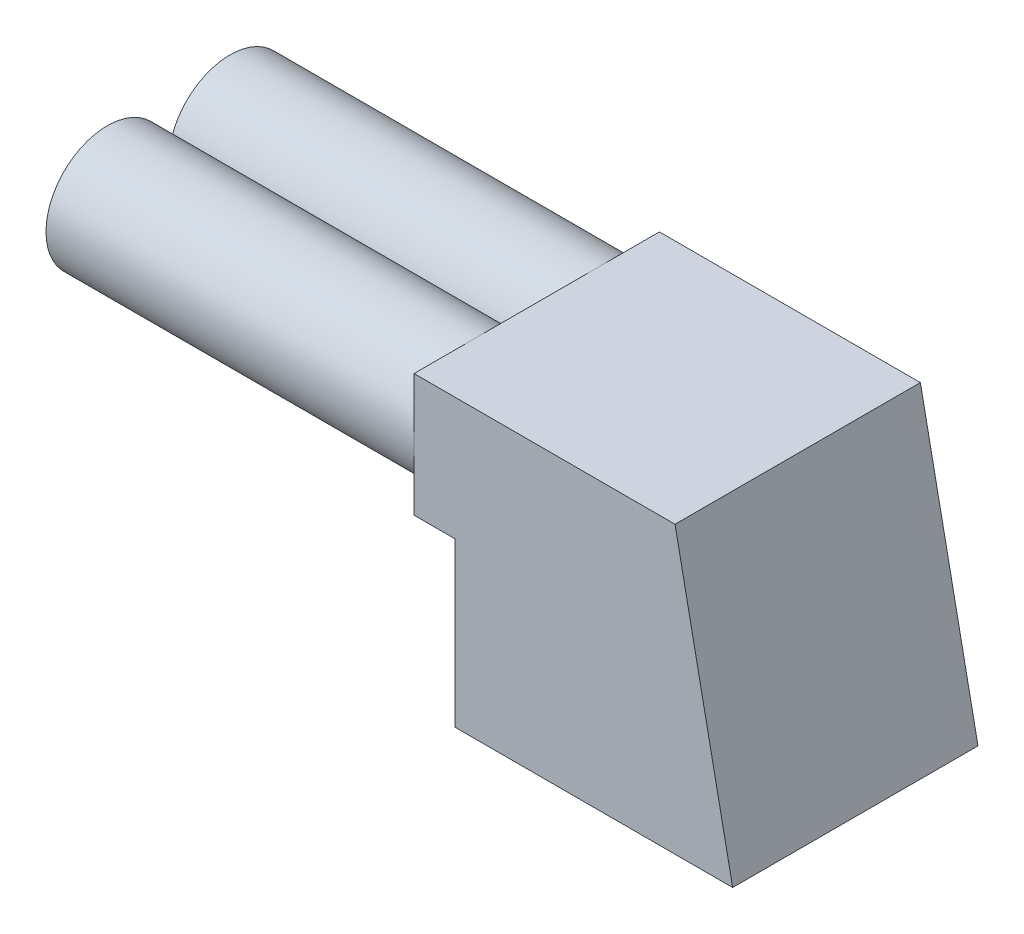
ISO-10303-21;
HEADER;
FILE_DESCRIPTION(('STEP AP214'),'2;1');
FILE_NAME('part.step','',(''),(''),'','','');
FILE_SCHEMA(('AUTOMOTIVE_DESIGN { 1 0 10303 214 1 1 1 1 }'));
ENDSEC;
DATA;
#1=APPLICATION_CONTEXT('core data for automotive mechanical design processes');
#2=APPLICATION_PROTOCOL_DEFINITION('international standard','automotive_design',2000,#1);
#3=PRODUCT_CONTEXT('',#1,'mechanical');
#4=PRODUCT('Part','Part','',(#3));
#5=PRODUCT_RELATED_PRODUCT_CATEGORY('part','',(#4));
#6=PRODUCT_DEFINITION_FORMATION('','',#4);
#7=PRODUCT_DEFINITION_CONTEXT('part definition',#1,'design');
#8=PRODUCT_DEFINITION('design','',#6,#7);
#9=PRODUCT_DEFINITION_SHAPE('','',#8);
#10=(LENGTH_UNIT() NAMED_UNIT(*) SI_UNIT(.MILLI.,.METRE.));
#11=(NAMED_UNIT(*) PLANE_ANGLE_UNIT() SI_UNIT($,.RADIAN.));
#12=(NAMED_UNIT(*) SI_UNIT($,.STERADIAN.) SOLID_ANGLE_UNIT());
#13=UNCERTAINTY_MEASURE_WITH_UNIT(LENGTH_MEASURE(1.E-05),#10,'distance_accuracy_value','');
#14=(GEOMETRIC_REPRESENTATION_CONTEXT(3) GLOBAL_UNCERTAINTY_ASSIGNED_CONTEXT((#13)) GLOBAL_UNIT_ASSIGNED_CONTEXT((#10,
#11,#12)) REPRESENTATION_CONTEXT('',''));
#15=CARTESIAN_POINT('',(0.,0.,0.));
#16=DIRECTION('',(0.,0.,1.));
#17=DIRECTION('',(1.,0.,0.));
#18=AXIS2_PLACEMENT_3D('',#15,#16,#17);
#19=CARTESIAN_POINT('',(-27.0557558945909,69.8940360610263,-30.));
#20=DIRECTION('',(-1.,0.,0.));
#21=DIRECTION('',(0.,0.,1.));
#22=AXIS2_PLACEMENT_3D('',#19,#20,#21);
#23=PLANE('',#22);
#24=DIRECTION('',(0.,-1.,0.));
#25=VECTOR('',#24,1.);
#26=CARTESIAN_POINT('',(-27.0557558945909,69.8940360610263,30.));
#27=LINE('',#26,#25);
#28=CARTESIAN_POINT('',(-27.0557558945909,39.8940360610263,30.));
#29=VERTEX_POINT('',#28);
#30=CARTESIAN_POINT('',(-27.0557558945909,0.,30.));
#31=VERTEX_POINT('',#30);
#32=EDGE_CURVE('E195',#29,#31,#27,.T.);
#33=ORIENTED_EDGE('',*,*,#32,.F.);
#34=DIRECTION('',(0.,0.,1.));
#35=VECTOR('',#34,1.);
#36=CARTESIAN_POINT('',(-27.0557558945909,39.8940360610263,-30.));
#37=LINE('',#36,#35);
#38=CARTESIAN_POINT('',(-27.0557558945909,39.8940360610263,-30.));
#39=VERTEX_POINT('',#38);
#40=EDGE_CURVE('E51',#39,#29,#37,.T.);
#41=ORIENTED_EDGE('',*,*,#40,.F.);
#42=DIRECTION('',(0.,-1.,0.));
#43=VECTOR('',#42,1.);
#44=CARTESIAN_POINT('',(-27.0557558945909,69.8940360610263,-30.));
#45=LINE('',#44,#43);
#46=CARTESIAN_POINT('',(-27.0557558945909,0.,-30.));
#47=VERTEX_POINT('',#46);
#48=EDGE_CURVE('E156',#39,#47,#45,.T.);
#49=ORIENTED_EDGE('',*,*,#48,.T.);
#50=DIRECTION('',(0.,0.,1.));
#51=VECTOR('',#50,1.);
#52=CARTESIAN_POINT('',(-27.0557558945909,0.,-30.));
#53=LINE('',#52,#51);
#54=EDGE_CURVE('E214',#47,#31,#53,.T.);
#55=ORIENTED_EDGE('',*,*,#54,.T.);
#56=EDGE_LOOP('',(#33,#41,#49,#55));
#57=FACE_BOUND('',#56,.T.);
#58=ADVANCED_FACE('F37',(#57),#23,.T.);
#59=CARTESIAN_POINT('',(26.7739251040222,69.8940360610263,-30.));
#60=DIRECTION('',(0.,1.,0.));
#61=DIRECTION('',(0.,0.,1.));
#62=AXIS2_PLACEMENT_3D('',#59,#60,#61);
#63=PLANE('',#62);
#64=DIRECTION('',(-1.,0.,0.));
#65=VECTOR('',#64,1.);
#66=CARTESIAN_POINT('',(26.7739251040222,69.8940360610263,-30.));
#67=LINE('',#66,#65);
#68=CARTESIAN_POINT('',(26.7739251040222,69.8940360610263,-30.));
#69=VERTEX_POINT('',#68);
#70=CARTESIAN_POINT('',(-37.0557558945909,69.8940360610263,-30.));
#71=VERTEX_POINT('',#70);
#72=EDGE_CURVE('E212',#69,#71,#67,.T.);
#73=ORIENTED_EDGE('',*,*,#72,.T.);
#74=DIRECTION('',(0.,0.,-1.));
#75=VECTOR('',#74,1.);
#76=CARTESIAN_POINT('',(-37.0557558945909,69.8940360610263,-30.));
#77=LINE('',#76,#75);
#78=CARTESIAN_POINT('',(-37.0557558945909,69.8940360610263,-15.));
#79=VERTEX_POINT('',#78);
#80=EDGE_CURVE('E248',#79,#71,#77,.T.);
#81=ORIENTED_EDGE('',*,*,#80,.F.);
#82=CARTESIAN_POINT('',(-37.0557558945909,69.8940360610263,15.));
#83=VERTEX_POINT('',#82);
#84=EDGE_CURVE('E250',#83,#79,#77,.T.);
#85=ORIENTED_EDGE('',*,*,#84,.F.);
#86=CARTESIAN_POINT('',(-37.0557558945909,69.8940360610263,30.));
#87=VERTEX_POINT('',#86);
#88=EDGE_CURVE('E164',#87,#83,#77,.T.);
#89=ORIENTED_EDGE('',*,*,#88,.F.);
#90=DIRECTION('',(-1.,0.,0.));
#91=VECTOR('',#90,1.);
#92=CARTESIAN_POINT('',(26.7739251040222,69.8940360610263,30.));
#93=LINE('',#92,#91);
#94=CARTESIAN_POINT('',(26.7739251040222,69.8940360610263,30.));
#95=VERTEX_POINT('',#94);
#96=EDGE_CURVE('E203',#95,#87,#93,.T.);
#97=ORIENTED_EDGE('',*,*,#96,.F.);
#98=DIRECTION('',(0.,0.,1.));
#99=VECTOR('',#98,1.);
#100=CARTESIAN_POINT('',(26.7739251040222,69.8940360610263,-30.));
#101=LINE('',#100,#99);
#102=EDGE_CURVE('E44',#69,#95,#101,.T.);
#103=ORIENTED_EDGE('',*,*,#102,.F.);
#104=EDGE_LOOP('',(#73,#81,#85,#89,#97,#103));
#105=FACE_BOUND('',#104,.T.);
#106=ADVANCED_FACE('F233',(#105),#63,.T.);
#107=CARTESIAN_POINT('',(40.8654646324549,0.,-30.));
#108=DIRECTION('',(0.980275441523285,0.197636177726469,0.));
#109=DIRECTION('',(-0.197636177726469,0.980275441523285,0.));
#110=AXIS2_PLACEMENT_3D('',#107,#108,#109);
#111=PLANE('',#110);
#112=ORIENTED_EDGE('',*,*,#102,.T.);
#113=DIRECTION('',(-0.197636177726469,0.980275441523285,0.));
#114=VECTOR('',#113,1.);
#115=CARTESIAN_POINT('',(40.8654646324549,0.,30.));
#116=LINE('',#115,#114);
#117=CARTESIAN_POINT('',(40.8654646324549,0.,30.));
#118=VERTEX_POINT('',#117);
#119=EDGE_CURVE('E200',#118,#95,#116,.T.);
#120=ORIENTED_EDGE('',*,*,#119,.F.);
#121=DIRECTION('',(0.,0.,1.));
#122=VECTOR('',#121,1.);
#123=CARTESIAN_POINT('',(40.8654646324549,0.,-30.));
#124=LINE('',#123,#122);
#125=CARTESIAN_POINT('',(40.8654646324549,0.,-30.));
#126=VERTEX_POINT('',#125);
#127=EDGE_CURVE('E216',#126,#118,#124,.T.);
#128=ORIENTED_EDGE('',*,*,#127,.F.);
#129=DIRECTION('',(-0.197636177726469,0.980275441523285,0.));
#130=VECTOR('',#129,1.);
#131=CARTESIAN_POINT('',(40.8654646324549,0.,-30.));
#132=LINE('',#131,#130);
#133=EDGE_CURVE('E209',#126,#69,#132,.T.);
#134=ORIENTED_EDGE('',*,*,#133,.T.);
#135=EDGE_LOOP('',(#112,#120,#128,#134));
#136=FACE_BOUND('',#135,.T.);
#137=ADVANCED_FACE('F229',(#136),#111,.T.);
#138=CARTESIAN_POINT('',(-27.0557558945909,0.,-30.));
#139=DIRECTION('',(0.,-1.,0.));
#140=DIRECTION('',(0.,0.,-1.));
#141=AXIS2_PLACEMENT_3D('',#138,#139,#140);
#142=PLANE('',#141);
#143=ORIENTED_EDGE('',*,*,#127,.T.);
#144=DIRECTION('',(1.,0.,0.));
#145=VECTOR('',#144,1.);
#146=CARTESIAN_POINT('',(-27.0557558945909,0.,30.));
#147=LINE('',#146,#145);
#148=EDGE_CURVE('E197',#31,#118,#147,.T.);
#149=ORIENTED_EDGE('',*,*,#148,.F.);
#150=ORIENTED_EDGE('',*,*,#54,.F.);
#151=DIRECTION('',(1.,0.,0.));
#152=VECTOR('',#151,1.);
#153=CARTESIAN_POINT('',(-27.0557558945909,0.,-30.));
#154=LINE('',#153,#152);
#155=EDGE_CURVE('E206',#47,#126,#154,.T.);
#156=ORIENTED_EDGE('',*,*,#155,.T.);
#157=EDGE_LOOP('',(#143,#149,#150,#156));
#158=FACE_BOUND('',#157,.T.);
#159=ADVANCED_FACE('F223',(#158),#142,.T.);
#160=CARTESIAN_POINT('',(0.,0.,-30.));
#161=DIRECTION('',(0.,0.,1.));
#162=DIRECTION('',(1.,0.,0.));
#163=AXIS2_PLACEMENT_3D('',#160,#161,#162);
#164=PLANE('',#163);
#165=DIRECTION('',(0.,-1.,0.));
#166=VECTOR('',#165,1.);
#167=CARTESIAN_POINT('',(-37.0557558945909,69.8940360610263,-30.));
#168=LINE('',#167,#166);
#169=CARTESIAN_POINT('',(-37.0557558945909,54.8940360610263,-30.));
#170=VERTEX_POINT('',#169);
#171=EDGE_CURVE('E142',#71,#170,#168,.T.);
#172=ORIENTED_EDGE('',*,*,#171,.F.);
#173=ORIENTED_EDGE('',*,*,#72,.F.);
#174=ORIENTED_EDGE('',*,*,#133,.F.);
#175=ORIENTED_EDGE('',*,*,#155,.F.);
#176=ORIENTED_EDGE('',*,*,#48,.F.);
#177=DIRECTION('',(1.,0.,0.));
#178=VECTOR('',#177,1.);
#179=CARTESIAN_POINT('',(-37.0557558945909,39.8940360610263,-30.));
#180=LINE('',#179,#178);
#181=CARTESIAN_POINT('',(-37.0557558945909,39.8940360610263,-30.));
#182=VERTEX_POINT('',#181);
#183=EDGE_CURVE('E146',#182,#39,#180,.T.);
#184=ORIENTED_EDGE('',*,*,#183,.F.);
#185=EDGE_CURVE('E132',#170,#182,#168,.T.);
#186=ORIENTED_EDGE('',*,*,#185,.F.);
#187=EDGE_LOOP('',(#172,#173,#174,#175,#176,#184,#186));
#188=FACE_BOUND('',#187,.T.);
#189=ADVANCED_FACE('F154',(#188),#164,.F.);
#190=CARTESIAN_POINT('',(0.,0.,30.));
#191=DIRECTION('',(0.,0.,1.));
#192=DIRECTION('',(1.,0.,0.));
#193=AXIS2_PLACEMENT_3D('',#190,#191,#192);
#194=PLANE('',#193);
#195=ORIENTED_EDGE('',*,*,#96,.T.);
#196=DIRECTION('',(0.,1.,0.));
#197=VECTOR('',#196,1.);
#198=CARTESIAN_POINT('',(-37.0557558945909,69.8940360610263,30.));
#199=LINE('',#198,#197);
#200=CARTESIAN_POINT('',(-37.0557558945909,54.8940360610263,30.));
#201=VERTEX_POINT('',#200);
#202=EDGE_CURVE('E151',#201,#87,#199,.T.);
#203=ORIENTED_EDGE('',*,*,#202,.F.);
#204=CARTESIAN_POINT('',(-37.0557558945909,39.8940360610263,30.));
#205=VERTEX_POINT('',#204);
#206=EDGE_CURVE('E246',#205,#201,#199,.T.);
#207=ORIENTED_EDGE('',*,*,#206,.F.);
#208=DIRECTION('',(1.,0.,0.));
#209=VECTOR('',#208,1.);
#210=CARTESIAN_POINT('',(-37.0557558945909,39.8940360610263,30.));
#211=LINE('',#210,#209);
#212=EDGE_CURVE('E158',#205,#29,#211,.T.);
#213=ORIENTED_EDGE('',*,*,#212,.T.);
#214=ORIENTED_EDGE('',*,*,#32,.T.);
#215=ORIENTED_EDGE('',*,*,#148,.T.);
#216=ORIENTED_EDGE('',*,*,#119,.T.);
#217=EDGE_LOOP('',(#195,#203,#207,#213,#214,#215,#216));
#218=FACE_BOUND('',#217,.T.);
#219=ADVANCED_FACE('F226',(#218),#194,.T.);
#220=CARTESIAN_POINT('',(-37.0557558945909,39.8940360610263,-30.));
#221=DIRECTION('',(0.,1.,0.));
#222=DIRECTION('',(0.,0.,1.));
#223=AXIS2_PLACEMENT_3D('',#220,#221,#222);
#224=PLANE('',#223);
#225=DIRECTION('',(0.,0.,1.));
#226=VECTOR('',#225,1.);
#227=CARTESIAN_POINT('',(-37.0557558945909,39.8940360610263,-30.));
#228=LINE('',#227,#226);
#229=CARTESIAN_POINT('',(-37.0557558945909,39.8940360610263,-15.));
#230=VERTEX_POINT('',#229);
#231=CARTESIAN_POINT('',(-37.0557558945909,39.8940360610263,15.));
#232=VERTEX_POINT('',#231);
#233=EDGE_CURVE('E150',#230,#232,#228,.T.);
#234=ORIENTED_EDGE('',*,*,#233,.F.);
#235=EDGE_CURVE('E135',#182,#230,#228,.T.);
#236=ORIENTED_EDGE('',*,*,#235,.F.);
#237=ORIENTED_EDGE('',*,*,#183,.T.);
#238=ORIENTED_EDGE('',*,*,#40,.T.);
#239=ORIENTED_EDGE('',*,*,#212,.F.);
#240=EDGE_CURVE('E153',#232,#205,#228,.T.);
#241=ORIENTED_EDGE('',*,*,#240,.F.);
#242=EDGE_LOOP('',(#234,#236,#237,#238,#239,#241));
#243=FACE_BOUND('',#242,.T.);
#244=ADVANCED_FACE('F145',(#243),#224,.F.);
#245=CARTESIAN_POINT('',(-37.0557558945909,0.,0.));
#246=DIRECTION('',(-1.,0.,0.));
#247=DIRECTION('',(0.,0.,1.));
#248=AXIS2_PLACEMENT_3D('',#245,#246,#247);
#249=PLANE('',#248);
#250=CARTESIAN_POINT('',(-37.0557558945909,54.8940360610263,-15.));
#251=DIRECTION('',(-1.,0.,0.));
#252=DIRECTION('',(0.,0.,1.));
#253=AXIS2_PLACEMENT_3D('',#250,#251,#252);
#254=CIRCLE('',#253,15.);
#255=EDGE_CURVE('E137',#170,#230,#254,.T.);
#256=ORIENTED_EDGE('',*,*,#255,.F.);
#257=ORIENTED_EDGE('',*,*,#185,.T.);
#258=ORIENTED_EDGE('',*,*,#235,.T.);
#259=EDGE_LOOP('',(#256,#257,#258));
#260=FACE_BOUND('',#259,.T.);
#261=ADVANCED_FACE('F134',(#260),#249,.T.);
#262=CARTESIAN_POINT('',(-37.0557558945909,54.0820940607758,-0.0219911140289016));
#263=VERTEX_POINT('',#262);
#264=EDGE_CURVE('E173',#230,#263,#254,.T.);
#265=ORIENTED_EDGE('',*,*,#264,.F.);
#266=ORIENTED_EDGE('',*,*,#233,.T.);
#267=CARTESIAN_POINT('',(-37.0557558945909,54.8940360610263,15.));
#268=DIRECTION('',(-1.,0.,0.));
#269=DIRECTION('',(0.,0.,1.));
#270=AXIS2_PLACEMENT_3D('',#267,#268,#269);
#271=CIRCLE('',#270,15.);
#272=CARTESIAN_POINT('',(-37.0557558945909,54.0820940607758,0.0219911140289016));
#273=VERTEX_POINT('',#272);
#274=EDGE_CURVE('E163',#273,#232,#271,.T.);
#275=ORIENTED_EDGE('',*,*,#274,.F.);
#276=DIRECTION('',(0.,0.,1.));
#277=VECTOR('',#276,1.);
#278=CARTESIAN_POINT('',(-37.0557558945909,54.0820940607758,-0.0219911140289016));
#279=LINE('',#278,#277);
#280=EDGE_CURVE('E170',#263,#273,#279,.T.);
#281=ORIENTED_EDGE('',*,*,#280,.F.);
#282=EDGE_LOOP('',(#265,#266,#275,#281));
#283=FACE_BOUND('',#282,.T.);
#284=ADVANCED_FACE('F257',(#283),#249,.T.);
#285=EDGE_CURVE('E262',#232,#201,#271,.T.);
#286=ORIENTED_EDGE('',*,*,#285,.F.);
#287=ORIENTED_EDGE('',*,*,#240,.T.);
#288=ORIENTED_EDGE('',*,*,#206,.T.);
#289=EDGE_LOOP('',(#286,#287,#288));
#290=FACE_BOUND('',#289,.T.);
#291=ADVANCED_FACE('F421',(#290),#249,.T.);
#292=EDGE_CURVE('E169',#79,#170,#254,.T.);
#293=ORIENTED_EDGE('',*,*,#292,.F.);
#294=ORIENTED_EDGE('',*,*,#80,.T.);
#295=ORIENTED_EDGE('',*,*,#171,.T.);
#296=EDGE_LOOP('',(#293,#294,#295));
#297=FACE_BOUND('',#296,.T.);
#298=ADVANCED_FACE('F252',(#297),#249,.T.);
#299=CARTESIAN_POINT('',(-37.0557558945909,55.534049081074,-0.0136601088134448));
#300=VERTEX_POINT('',#299);
#301=EDGE_CURVE('E59',#300,#79,#254,.T.);
#302=ORIENTED_EDGE('',*,*,#301,.F.);
#303=DIRECTION('',(0.,0.,-1.));
#304=VECTOR('',#303,1.);
#305=CARTESIAN_POINT('',(-37.0557558945909,55.534049081074,-0.0136601088134448));
#306=LINE('',#305,#304);
#307=CARTESIAN_POINT('',(-37.0557558945909,55.534049081074,0.0136601088134448));
#308=VERTEX_POINT('',#307);
#309=EDGE_CURVE('E11',#308,#300,#306,.T.);
#310=ORIENTED_EDGE('',*,*,#309,.F.);
#311=EDGE_CURVE('E157',#83,#308,#271,.T.);
#312=ORIENTED_EDGE('',*,*,#311,.F.);
#313=ORIENTED_EDGE('',*,*,#84,.T.);
#314=EDGE_LOOP('',(#302,#310,#312,#313));
#315=FACE_BOUND('',#314,.T.);
#316=ADVANCED_FACE('F404',(#315),#249,.T.);
#317=EDGE_CURVE('E161',#201,#83,#271,.T.);
#318=ORIENTED_EDGE('',*,*,#317,.F.);
#319=ORIENTED_EDGE('',*,*,#202,.T.);
#320=ORIENTED_EDGE('',*,*,#88,.T.);
#321=EDGE_LOOP('',(#318,#319,#320));
#322=FACE_BOUND('',#321,.T.);
#323=ADVANCED_FACE('F244',(#322),#249,.T.);
#324=CARTESIAN_POINT('',(-127.055755894591,54.8940360610263,-15.));
#325=DIRECTION('',(-1.,0.,0.));
#326=DIRECTION('',(0.,0.,1.));
#327=AXIS2_PLACEMENT_3D('',#324,#325,#326);
#328=PLANE('',#327);
#329=CARTESIAN_POINT('',(-127.055755894591,54.8940360610263,-15.));
#330=DIRECTION('',(-1.,0.,0.));
#331=DIRECTION('',(0.,0.,1.));
#332=AXIS2_PLACEMENT_3D('',#329,#330,#331);
#333=CIRCLE('',#332,15.);
#334=CARTESIAN_POINT('',(-127.055755894591,55.534049081074,-0.0136601088134448));
#335=VERTEX_POINT('',#334);
#336=CARTESIAN_POINT('',(-127.055755894591,54.0820940607758,-0.0219911140289016));
#337=VERTEX_POINT('',#336);
#338=EDGE_CURVE('E174',#335,#337,#333,.T.);
#339=ORIENTED_EDGE('',*,*,#338,.T.);
#340=DIRECTION('',(0.,0.,1.));
#341=VECTOR('',#340,1.);
#342=CARTESIAN_POINT('',(-127.055755894591,54.0820940607758,-0.0219911140289016));
#343=LINE('',#342,#341);
#344=CARTESIAN_POINT('',(-127.055755894591,54.0820940607758,0.0219911140289016));
#345=VERTEX_POINT('',#344);
#346=EDGE_CURVE('E177',#337,#345,#343,.T.);
#347=ORIENTED_EDGE('',*,*,#346,.T.);
#348=CARTESIAN_POINT('',(-127.055755894591,54.8940360610263,15.));
#349=DIRECTION('',(-1.,0.,0.));
#350=DIRECTION('',(0.,0.,1.));
#351=AXIS2_PLACEMENT_3D('',#348,#349,#350);
#352=CIRCLE('',#351,15.);
#353=CARTESIAN_POINT('',(-127.055755894591,55.534049081074,0.0136601088134448));
#354=VERTEX_POINT('',#353);
#355=EDGE_CURVE('E179',#345,#354,#352,.T.);
#356=ORIENTED_EDGE('',*,*,#355,.T.);
#357=DIRECTION('',(0.,0.,-1.));
#358=VECTOR('',#357,1.);
#359=CARTESIAN_POINT('',(-127.055755894591,55.534049081074,-0.0136601088134448));
#360=LINE('',#359,#358);
#361=EDGE_CURVE('E181',#354,#335,#360,.T.);
#362=ORIENTED_EDGE('',*,*,#361,.T.);
#363=EDGE_LOOP('',(#339,#347,#356,#362));
#364=FACE_BOUND('',#363,.T.);
#365=ADVANCED_FACE('F272',(#364),#328,.T.);
#366=CARTESIAN_POINT('',(-127.055755894591,55.534049081074,-0.0136601088134448));
#367=DIRECTION('',(0.,-1.,0.));
#368=DIRECTION('',(0.,0.,-1.));
#369=AXIS2_PLACEMENT_3D('',#366,#367,#368);
#370=PLANE('',#369);
#371=DIRECTION('',(1.,0.,0.));
#372=VECTOR('',#371,1.);
#373=CARTESIAN_POINT('',(-127.055755894591,55.534049081074,0.0136601088134448));
#374=LINE('',#373,#372);
#375=EDGE_CURVE('E186',#354,#308,#374,.T.);
#376=ORIENTED_EDGE('',*,*,#375,.T.);
#377=ORIENTED_EDGE('',*,*,#309,.T.);
#378=DIRECTION('',(1.,0.,0.));
#379=VECTOR('',#378,1.);
#380=CARTESIAN_POINT('',(-127.055755894591,55.534049081074,-0.0136601088134448));
#381=LINE('',#380,#379);
#382=EDGE_CURVE('E183',#335,#300,#381,.T.);
#383=ORIENTED_EDGE('',*,*,#382,.F.);
#384=ORIENTED_EDGE('',*,*,#361,.F.);
#385=EDGE_LOOP('',(#376,#377,#383,#384));
#386=FACE_BOUND('',#385,.T.);
#387=ADVANCED_FACE('F268',(#386),#370,.F.);
#388=CARTESIAN_POINT('',(-127.055755894591,54.8940360610263,15.));
#389=DIRECTION('',(1.,0.,0.));
#390=DIRECTION('',(0.,0.,-1.));
#391=AXIS2_PLACEMENT_3D('',#388,#389,#390);
#392=CYLINDRICAL_SURFACE('',#391,15.);
#393=ORIENTED_EDGE('',*,*,#317,.T.);
#394=ORIENTED_EDGE('',*,*,#311,.T.);
#395=ORIENTED_EDGE('',*,*,#375,.F.);
#396=ORIENTED_EDGE('',*,*,#355,.F.);
#397=DIRECTION('',(1.,0.,0.));
#398=VECTOR('',#397,1.);
#399=CARTESIAN_POINT('',(-127.055755894591,54.0820940607758,0.0219911140289016));
#400=LINE('',#399,#398);
#401=EDGE_CURVE('E189',#345,#273,#400,.T.);
#402=ORIENTED_EDGE('',*,*,#401,.T.);
#403=ORIENTED_EDGE('',*,*,#274,.T.);
#404=ORIENTED_EDGE('',*,*,#285,.T.);
#405=EDGE_LOOP('',(#393,#394,#395,#396,#402,#403,#404));
#406=FACE_BOUND('',#405,.T.);
#407=ADVANCED_FACE('F261',(#406),#392,.T.);
#408=CARTESIAN_POINT('',(-127.055755894591,54.0820940607758,-0.0219911140289016));
#409=DIRECTION('',(0.,1.,0.));
#410=DIRECTION('',(0.,0.,1.));
#411=AXIS2_PLACEMENT_3D('',#408,#409,#410);
#412=PLANE('',#411);
#413=DIRECTION('',(1.,0.,0.));
#414=VECTOR('',#413,1.);
#415=CARTESIAN_POINT('',(-127.055755894591,54.0820940607758,-0.0219911140289016));
#416=LINE('',#415,#414);
#417=EDGE_CURVE('E192',#337,#263,#416,.T.);
#418=ORIENTED_EDGE('',*,*,#417,.T.);
#419=ORIENTED_EDGE('',*,*,#280,.T.);
#420=ORIENTED_EDGE('',*,*,#401,.F.);
#421=ORIENTED_EDGE('',*,*,#346,.F.);
#422=EDGE_LOOP('',(#418,#419,#420,#421));
#423=FACE_BOUND('',#422,.T.);
#424=ADVANCED_FACE('F275',(#423),#412,.F.);
#425=CARTESIAN_POINT('',(-127.055755894591,54.8940360610263,-15.));
#426=DIRECTION('',(1.,0.,0.));
#427=DIRECTION('',(0.,0.,-1.));
#428=AXIS2_PLACEMENT_3D('',#425,#426,#427);
#429=CYLINDRICAL_SURFACE('',#428,15.);
#430=ORIENTED_EDGE('',*,*,#292,.T.);
#431=ORIENTED_EDGE('',*,*,#255,.T.);
#432=ORIENTED_EDGE('',*,*,#264,.T.);
#433=ORIENTED_EDGE('',*,*,#417,.F.);
#434=ORIENTED_EDGE('',*,*,#338,.F.);
#435=ORIENTED_EDGE('',*,*,#382,.T.);
#436=ORIENTED_EDGE('',*,*,#301,.T.);
#437=EDGE_LOOP('',(#430,#431,#432,#433,#434,#435,#436));
#438=FACE_BOUND('',#437,.T.);
#439=ADVANCED_FACE('F277',(#438),#429,.T.);
#440=CLOSED_SHELL('',(#58,#106,#137,#159,#189,#219,#244,#261,#284,#291,#298,#316,#323,#365,#387,
#407,#424,#439));
#441=MANIFOLD_SOLID_BREP('B2',#440);
#442=ADVANCED_BREP_SHAPE_REPRESENTATION('',(#18,#441),#14);
#443=SHAPE_DEFINITION_REPRESENTATION(#9,#442);
ENDSEC;
END-ISO-10303-21;
